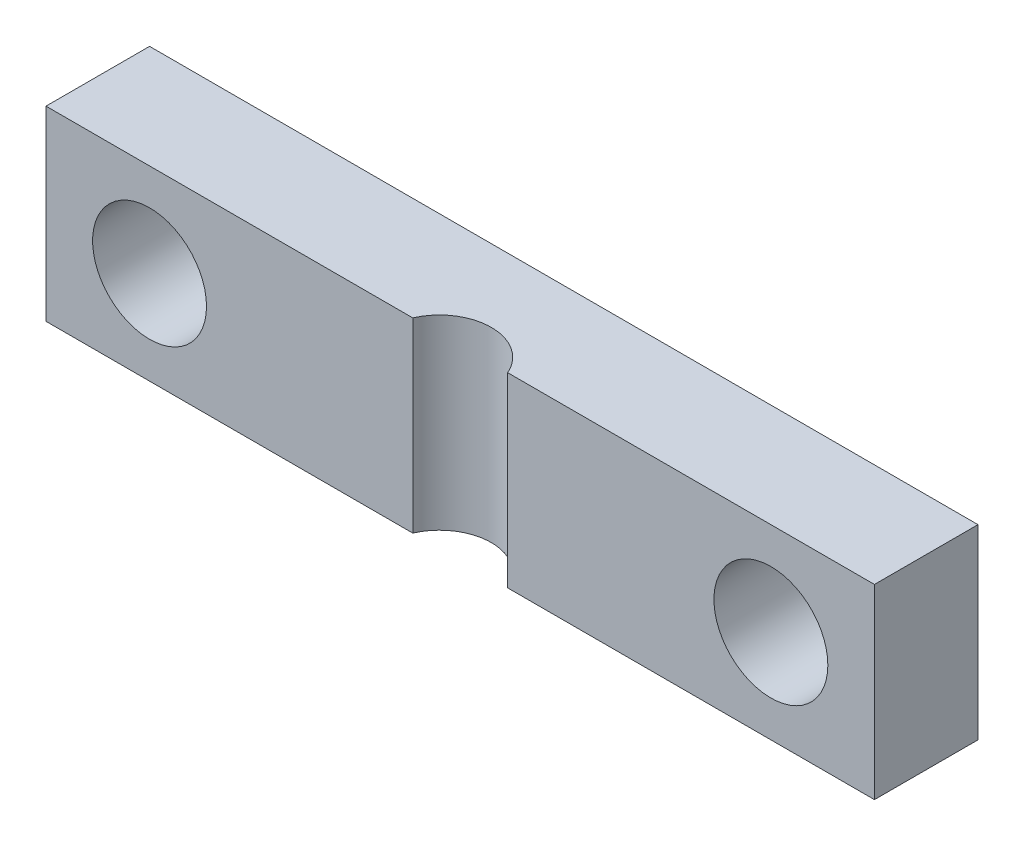
ISO-10303-21;
HEADER;
FILE_DESCRIPTION(('STEP AP214'),'2;1');
FILE_NAME('part.step','',(''),(''),'','','');
FILE_SCHEMA(('AUTOMOTIVE_DESIGN { 1 0 10303 214 1 1 1 1 }'));
ENDSEC;
DATA;
#1=APPLICATION_CONTEXT('core data for automotive mechanical design processes');
#2=APPLICATION_PROTOCOL_DEFINITION('international standard','automotive_design',2000,#1);
#3=PRODUCT_CONTEXT('',#1,'mechanical');
#4=PRODUCT('Part','Part','',(#3));
#5=PRODUCT_RELATED_PRODUCT_CATEGORY('part','',(#4));
#6=PRODUCT_DEFINITION_FORMATION('','',#4);
#7=PRODUCT_DEFINITION_CONTEXT('part definition',#1,'design');
#8=PRODUCT_DEFINITION('design','',#6,#7);
#9=PRODUCT_DEFINITION_SHAPE('','',#8);
#10=(LENGTH_UNIT() NAMED_UNIT(*) SI_UNIT(.MILLI.,.METRE.));
#11=(NAMED_UNIT(*) PLANE_ANGLE_UNIT() SI_UNIT($,.RADIAN.));
#12=(NAMED_UNIT(*) SI_UNIT($,.STERADIAN.) SOLID_ANGLE_UNIT());
#13=UNCERTAINTY_MEASURE_WITH_UNIT(LENGTH_MEASURE(1.E-05),#10,'distance_accuracy_value','');
#14=(GEOMETRIC_REPRESENTATION_CONTEXT(3) GLOBAL_UNCERTAINTY_ASSIGNED_CONTEXT((#13)) GLOBAL_UNIT_ASSIGNED_CONTEXT((#10,
#11,#12)) REPRESENTATION_CONTEXT('',''));
#15=CARTESIAN_POINT('',(0.,0.,0.));
#16=DIRECTION('',(0.,0.,1.));
#17=DIRECTION('',(1.,0.,0.));
#18=AXIS2_PLACEMENT_3D('',#15,#16,#17);
#19=CARTESIAN_POINT('',(0.,0.,5.));
#20=DIRECTION('',(0.,0.,1.));
#21=DIRECTION('',(1.,0.,0.));
#22=AXIS2_PLACEMENT_3D('',#19,#20,#21);
#23=PLANE('',#22);
#24=DIRECTION('',(0.,1.,0.));
#25=VECTOR('',#24,1.);
#26=CARTESIAN_POINT('',(2.29128784747792,-0.999999999999999,5.));
#27=LINE('',#26,#25);
#28=CARTESIAN_POINT('',(2.29128784747792,0.,5.));
#29=VERTEX_POINT('',#28);
#30=CARTESIAN_POINT('',(2.29128784747792,9.,5.));
#31=VERTEX_POINT('',#30);
#32=EDGE_CURVE('E11',#29,#31,#27,.T.);
#33=ORIENTED_EDGE('',*,*,#32,.F.);
#34=DIRECTION('',(1.,0.,0.));
#35=VECTOR('',#34,1.);
#36=CARTESIAN_POINT('',(-20.,0.,5.));
#37=LINE('',#36,#35);
#38=CARTESIAN_POINT('',(20.,0.,5.));
#39=VERTEX_POINT('',#38);
#40=EDGE_CURVE('E138',#29,#39,#37,.T.);
#41=ORIENTED_EDGE('',*,*,#40,.T.);
#42=DIRECTION('',(0.,1.,0.));
#43=VECTOR('',#42,1.);
#44=CARTESIAN_POINT('',(20.,9.,5.));
#45=LINE('',#44,#43);
#46=CARTESIAN_POINT('',(20.,9.,5.));
#47=VERTEX_POINT('',#46);
#48=EDGE_CURVE('E106',#39,#47,#45,.T.);
#49=ORIENTED_EDGE('',*,*,#48,.T.);
#50=DIRECTION('',(-1.,0.,0.));
#51=VECTOR('',#50,1.);
#52=CARTESIAN_POINT('',(-20.,9.,5.));
#53=LINE('',#52,#51);
#54=EDGE_CURVE('E102',#47,#31,#53,.T.);
#55=ORIENTED_EDGE('',*,*,#54,.T.);
#56=EDGE_LOOP('',(#33,#41,#49,#55));
#57=FACE_BOUND('',#56,.T.);
#58=CARTESIAN_POINT('',(15.,4.5,5.));
#59=DIRECTION('',(0.,0.,1.));
#60=DIRECTION('',(1.,0.,0.));
#61=AXIS2_PLACEMENT_3D('',#58,#59,#60);
#62=CIRCLE('',#61,2.75);
#63=CARTESIAN_POINT('',(17.75,4.5,5.));
#64=VERTEX_POINT('',#63);
#65=EDGE_CURVE('E134',#64,#64,#62,.T.);
#66=ORIENTED_EDGE('',*,*,#65,.F.);
#67=EDGE_LOOP('',(#66));
#68=FACE_BOUND('',#67,.T.);
#69=ADVANCED_FACE('F34',(#57,#68),#23,.T.);
#70=CARTESIAN_POINT('',(-20.,9.,5.));
#71=DIRECTION('',(1.,0.,0.));
#72=DIRECTION('',(0.,1.,0.));
#73=AXIS2_PLACEMENT_3D('',#70,#71,#72);
#74=PLANE('',#73);
#75=DIRECTION('',(0.,-1.,0.));
#76=VECTOR('',#75,1.);
#77=CARTESIAN_POINT('',(-20.,9.,0.));
#78=LINE('',#77,#76);
#79=CARTESIAN_POINT('',(-20.,9.,0.));
#80=VERTEX_POINT('',#79);
#81=CARTESIAN_POINT('',(-20.,0.,0.));
#82=VERTEX_POINT('',#81);
#83=EDGE_CURVE('E115',#80,#82,#78,.T.);
#84=ORIENTED_EDGE('',*,*,#83,.T.);
#85=DIRECTION('',(0.,0.,-1.));
#86=VECTOR('',#85,1.);
#87=CARTESIAN_POINT('',(-20.,0.,5.));
#88=LINE('',#87,#86);
#89=CARTESIAN_POINT('',(-20.,0.,5.));
#90=VERTEX_POINT('',#89);
#91=EDGE_CURVE('E129',#90,#82,#88,.T.);
#92=ORIENTED_EDGE('',*,*,#91,.F.);
#93=DIRECTION('',(0.,-1.,0.));
#94=VECTOR('',#93,1.);
#95=CARTESIAN_POINT('',(-20.,9.,5.));
#96=LINE('',#95,#94);
#97=CARTESIAN_POINT('',(-20.,9.,5.));
#98=VERTEX_POINT('',#97);
#99=EDGE_CURVE('E123',#98,#90,#96,.T.);
#100=ORIENTED_EDGE('',*,*,#99,.F.);
#101=DIRECTION('',(0.,0.,-1.));
#102=VECTOR('',#101,1.);
#103=CARTESIAN_POINT('',(-20.,9.,5.));
#104=LINE('',#103,#102);
#105=EDGE_CURVE('E108',#98,#80,#104,.T.);
#106=ORIENTED_EDGE('',*,*,#105,.T.);
#107=EDGE_LOOP('',(#84,#92,#100,#106));
#108=FACE_BOUND('',#107,.T.);
#109=ADVANCED_FACE('F36',(#108),#74,.F.);
#110=CARTESIAN_POINT('',(-20.,0.,5.));
#111=DIRECTION('',(0.,1.,0.));
#112=DIRECTION('',(0.,0.,1.));
#113=AXIS2_PLACEMENT_3D('',#110,#111,#112);
#114=PLANE('',#113);
#115=ORIENTED_EDGE('',*,*,#40,.F.);
#116=CARTESIAN_POINT('',(0.,0.,6.));
#117=DIRECTION('',(0.,1.,0.));
#118=DIRECTION('',(0.,0.,1.));
#119=AXIS2_PLACEMENT_3D('',#116,#117,#118);
#120=CIRCLE('',#119,2.5);
#121=CARTESIAN_POINT('',(-2.29128784747792,0.,5.));
#122=VERTEX_POINT('',#121);
#123=EDGE_CURVE('E96',#29,#122,#120,.T.);
#124=ORIENTED_EDGE('',*,*,#123,.T.);
#125=EDGE_CURVE('E86',#90,#122,#37,.T.);
#126=ORIENTED_EDGE('',*,*,#125,.F.);
#127=ORIENTED_EDGE('',*,*,#91,.T.);
#128=DIRECTION('',(1.,0.,0.));
#129=VECTOR('',#128,1.);
#130=CARTESIAN_POINT('',(-20.,0.,0.));
#131=LINE('',#130,#129);
#132=CARTESIAN_POINT('',(20.,0.,0.));
#133=VERTEX_POINT('',#132);
#134=EDGE_CURVE('E118',#82,#133,#131,.T.);
#135=ORIENTED_EDGE('',*,*,#134,.T.);
#136=DIRECTION('',(0.,0.,-1.));
#137=VECTOR('',#136,1.);
#138=CARTESIAN_POINT('',(20.,0.,5.));
#139=LINE('',#138,#137);
#140=EDGE_CURVE('E126',#39,#133,#139,.T.);
#141=ORIENTED_EDGE('',*,*,#140,.F.);
#142=EDGE_LOOP('',(#115,#124,#126,#127,#135,#141));
#143=FACE_BOUND('',#142,.T.);
#144=ADVANCED_FACE('F136',(#143),#114,.F.);
#145=CARTESIAN_POINT('',(20.,9.,5.));
#146=DIRECTION('',(-1.,0.,0.));
#147=DIRECTION('',(0.,-1.,0.));
#148=AXIS2_PLACEMENT_3D('',#145,#146,#147);
#149=PLANE('',#148);
#150=DIRECTION('',(0.,1.,0.));
#151=VECTOR('',#150,1.);
#152=CARTESIAN_POINT('',(20.,9.,0.));
#153=LINE('',#152,#151);
#154=CARTESIAN_POINT('',(20.,9.,0.));
#155=VERTEX_POINT('',#154);
#156=EDGE_CURVE('E121',#133,#155,#153,.T.);
#157=ORIENTED_EDGE('',*,*,#156,.T.);
#158=DIRECTION('',(0.,0.,-1.));
#159=VECTOR('',#158,1.);
#160=CARTESIAN_POINT('',(20.,9.,5.));
#161=LINE('',#160,#159);
#162=EDGE_CURVE('E110',#47,#155,#161,.T.);
#163=ORIENTED_EDGE('',*,*,#162,.F.);
#164=ORIENTED_EDGE('',*,*,#48,.F.);
#165=ORIENTED_EDGE('',*,*,#140,.T.);
#166=EDGE_LOOP('',(#157,#163,#164,#165));
#167=FACE_BOUND('',#166,.T.);
#168=ADVANCED_FACE('F173',(#167),#149,.F.);
#169=CARTESIAN_POINT('',(-20.,9.,5.));
#170=DIRECTION('',(0.,-1.,0.));
#171=DIRECTION('',(0.,0.,-1.));
#172=AXIS2_PLACEMENT_3D('',#169,#170,#171);
#173=PLANE('',#172);
#174=CARTESIAN_POINT('',(-2.29128784747792,9.,5.));
#175=VERTEX_POINT('',#174);
#176=EDGE_CURVE('E56',#175,#98,#53,.T.);
#177=ORIENTED_EDGE('',*,*,#176,.F.);
#178=CARTESIAN_POINT('',(0.,9.,6.));
#179=DIRECTION('',(0.,1.,0.));
#180=DIRECTION('',(0.,0.,1.));
#181=AXIS2_PLACEMENT_3D('',#178,#179,#180);
#182=CIRCLE('',#181,2.5);
#183=EDGE_CURVE('E48',#31,#175,#182,.T.);
#184=ORIENTED_EDGE('',*,*,#183,.F.);
#185=ORIENTED_EDGE('',*,*,#54,.F.);
#186=ORIENTED_EDGE('',*,*,#162,.T.);
#187=DIRECTION('',(-1.,0.,0.));
#188=VECTOR('',#187,1.);
#189=CARTESIAN_POINT('',(-20.,9.,0.));
#190=LINE('',#189,#188);
#191=EDGE_CURVE('E78',#155,#80,#190,.T.);
#192=ORIENTED_EDGE('',*,*,#191,.T.);
#193=ORIENTED_EDGE('',*,*,#105,.F.);
#194=EDGE_LOOP('',(#177,#184,#185,#186,#192,#193));
#195=FACE_BOUND('',#194,.T.);
#196=ADVANCED_FACE('F101',(#195),#173,.F.);
#197=DIRECTION('',(0.,1.,0.));
#198=VECTOR('',#197,1.);
#199=CARTESIAN_POINT('',(-2.29128784747792,-0.999999999999999,5.));
#200=LINE('',#199,#198);
#201=EDGE_CURVE('E42',#175,#122,#200,.F.);
#202=ORIENTED_EDGE('',*,*,#201,.F.);
#203=ORIENTED_EDGE('',*,*,#176,.T.);
#204=ORIENTED_EDGE('',*,*,#99,.T.);
#205=ORIENTED_EDGE('',*,*,#125,.T.);
#206=EDGE_LOOP('',(#202,#203,#204,#205));
#207=FACE_BOUND('',#206,.T.);
#208=CARTESIAN_POINT('',(-15.,4.5,5.));
#209=DIRECTION('',(0.,0.,1.));
#210=DIRECTION('',(1.,0.,0.));
#211=AXIS2_PLACEMENT_3D('',#208,#209,#210);
#212=CIRCLE('',#211,2.75);
#213=CARTESIAN_POINT('',(-12.25,4.5,5.));
#214=VERTEX_POINT('',#213);
#215=EDGE_CURVE('E139',#214,#214,#212,.T.);
#216=ORIENTED_EDGE('',*,*,#215,.F.);
#217=EDGE_LOOP('',(#216));
#218=FACE_BOUND('',#217,.T.);
#219=ADVANCED_FACE('F141',(#207,#218),#23,.T.);
#220=CARTESIAN_POINT('',(0.,0.,0.));
#221=DIRECTION('',(0.,0.,1.));
#222=DIRECTION('',(1.,0.,0.));
#223=AXIS2_PLACEMENT_3D('',#220,#221,#222);
#224=PLANE('',#223);
#225=CARTESIAN_POINT('',(15.,4.5,0.));
#226=DIRECTION('',(0.,0.,1.));
#227=DIRECTION('',(1.,0.,0.));
#228=AXIS2_PLACEMENT_3D('',#225,#226,#227);
#229=CIRCLE('',#228,2.75);
#230=CARTESIAN_POINT('',(17.75,4.5,0.));
#231=VERTEX_POINT('',#230);
#232=EDGE_CURVE('E119',#231,#231,#229,.T.);
#233=ORIENTED_EDGE('',*,*,#232,.T.);
#234=EDGE_LOOP('',(#233));
#235=FACE_BOUND('',#234,.T.);
#236=CARTESIAN_POINT('',(-15.,4.5,0.));
#237=DIRECTION('',(0.,0.,1.));
#238=DIRECTION('',(1.,0.,0.));
#239=AXIS2_PLACEMENT_3D('',#236,#237,#238);
#240=CIRCLE('',#239,2.75);
#241=CARTESIAN_POINT('',(-12.25,4.5,0.));
#242=VERTEX_POINT('',#241);
#243=EDGE_CURVE('E131',#242,#242,#240,.T.);
#244=ORIENTED_EDGE('',*,*,#243,.T.);
#245=EDGE_LOOP('',(#244));
#246=FACE_BOUND('',#245,.T.);
#247=ORIENTED_EDGE('',*,*,#83,.F.);
#248=ORIENTED_EDGE('',*,*,#191,.F.);
#249=ORIENTED_EDGE('',*,*,#156,.F.);
#250=ORIENTED_EDGE('',*,*,#134,.F.);
#251=EDGE_LOOP('',(#247,#248,#249,#250));
#252=FACE_BOUND('',#251,.T.);
#253=ADVANCED_FACE('F165',(#235,#246,#252),#224,.F.);
#254=CARTESIAN_POINT('',(-15.,4.5,-5.));
#255=DIRECTION('',(0.,0.,1.));
#256=DIRECTION('',(1.,0.,0.));
#257=AXIS2_PLACEMENT_3D('',#254,#255,#256);
#258=CYLINDRICAL_SURFACE('',#257,2.75);
#259=ORIENTED_EDGE('',*,*,#215,.T.);
#260=EDGE_LOOP('',(#259));
#261=FACE_BOUND('',#260,.T.);
#262=ORIENTED_EDGE('',*,*,#243,.F.);
#263=EDGE_LOOP('',(#262));
#264=FACE_BOUND('',#263,.T.);
#265=ADVANCED_FACE('F171',(#261,#264),#258,.F.);
#266=CARTESIAN_POINT('',(15.,4.5,-5.));
#267=DIRECTION('',(0.,0.,1.));
#268=DIRECTION('',(1.,0.,0.));
#269=AXIS2_PLACEMENT_3D('',#266,#267,#268);
#270=CYLINDRICAL_SURFACE('',#269,2.75);
#271=ORIENTED_EDGE('',*,*,#65,.T.);
#272=EDGE_LOOP('',(#271));
#273=FACE_BOUND('',#272,.T.);
#274=ORIENTED_EDGE('',*,*,#232,.F.);
#275=EDGE_LOOP('',(#274));
#276=FACE_BOUND('',#275,.T.);
#277=ADVANCED_FACE('F152',(#273,#276),#270,.F.);
#278=CARTESIAN_POINT('',(0.,-0.999999999999999,6.));
#279=DIRECTION('',(0.,1.,0.));
#280=DIRECTION('',(0.,0.,1.));
#281=AXIS2_PLACEMENT_3D('',#278,#279,#280);
#282=CYLINDRICAL_SURFACE('',#281,2.5);
#283=ORIENTED_EDGE('',*,*,#32,.T.);
#284=ORIENTED_EDGE('',*,*,#183,.T.);
#285=ORIENTED_EDGE('',*,*,#201,.T.);
#286=ORIENTED_EDGE('',*,*,#123,.F.);
#287=EDGE_LOOP('',(#283,#284,#285,#286));
#288=FACE_BOUND('',#287,.T.);
#289=ADVANCED_FACE('F95',(#288),#282,.F.);
#290=CLOSED_SHELL('',(#69,#109,#144,#168,#196,#219,#253,#265,#277,#289));
#291=MANIFOLD_SOLID_BREP('B2',#290);
#292=ADVANCED_BREP_SHAPE_REPRESENTATION('',(#18,#291),#14);
#293=SHAPE_DEFINITION_REPRESENTATION(#9,#292);
ENDSEC;
END-ISO-10303-21;
